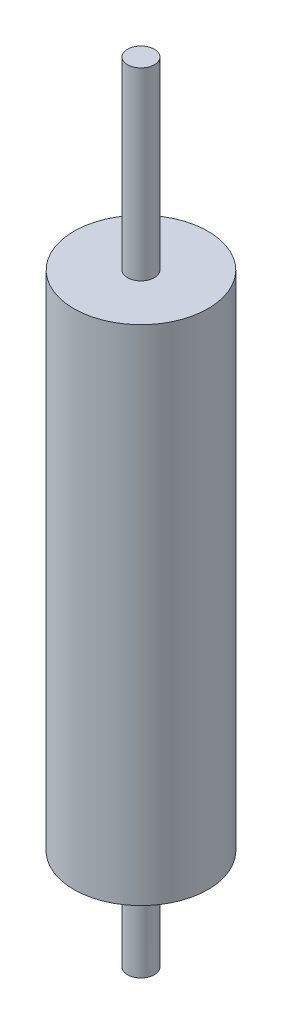
ISO-10303-21;
HEADER;
FILE_DESCRIPTION(('STEP AP214'),'2;1');
FILE_NAME('part.step','',(''),(''),'','','');
FILE_SCHEMA(('AUTOMOTIVE_DESIGN { 1 0 10303 214 1 1 1 1 }'));
ENDSEC;
DATA;
#1=APPLICATION_CONTEXT('core data for automotive mechanical design processes');
#2=APPLICATION_PROTOCOL_DEFINITION('international standard','automotive_design',2000,#1);
#3=PRODUCT_CONTEXT('',#1,'mechanical');
#4=PRODUCT('Part','Part','',(#3));
#5=PRODUCT_RELATED_PRODUCT_CATEGORY('part','',(#4));
#6=PRODUCT_DEFINITION_FORMATION('','',#4);
#7=PRODUCT_DEFINITION_CONTEXT('part definition',#1,'design');
#8=PRODUCT_DEFINITION('design','',#6,#7);
#9=PRODUCT_DEFINITION_SHAPE('','',#8);
#10=(LENGTH_UNIT() NAMED_UNIT(*) SI_UNIT(.MILLI.,.METRE.));
#11=(NAMED_UNIT(*) PLANE_ANGLE_UNIT() SI_UNIT($,.RADIAN.));
#12=(NAMED_UNIT(*) SI_UNIT($,.STERADIAN.) SOLID_ANGLE_UNIT());
#13=UNCERTAINTY_MEASURE_WITH_UNIT(LENGTH_MEASURE(1.E-05),#10,'distance_accuracy_value','');
#14=(GEOMETRIC_REPRESENTATION_CONTEXT(3) GLOBAL_UNCERTAINTY_ASSIGNED_CONTEXT((#13)) GLOBAL_UNIT_ASSIGNED_CONTEXT((#10,
#11,#12)) REPRESENTATION_CONTEXT('',''));
#15=CARTESIAN_POINT('',(0.,0.,0.));
#16=DIRECTION('',(0.,0.,1.));
#17=DIRECTION('',(1.,0.,0.));
#18=AXIS2_PLACEMENT_3D('',#15,#16,#17);
#19=CARTESIAN_POINT('',(0.,150.,0.));
#20=DIRECTION('',(0.,-1.,0.));
#21=DIRECTION('',(0.,0.,-1.));
#22=AXIS2_PLACEMENT_3D('',#19,#20,#21);
#23=CYLINDRICAL_SURFACE('',#22,20.);
#24=CARTESIAN_POINT('',(0.,150.,0.));
#25=DIRECTION('',(0.,1.,0.));
#26=DIRECTION('',(0.,0.,1.));
#27=AXIS2_PLACEMENT_3D('',#24,#25,#26);
#28=CIRCLE('',#27,20.);
#29=CARTESIAN_POINT('',(0.,150.,20.));
#30=VERTEX_POINT('',#29);
#31=EDGE_CURVE('E41',#30,#30,#28,.T.);
#32=ORIENTED_EDGE('',*,*,#31,.F.);
#33=EDGE_LOOP('',(#32));
#34=FACE_BOUND('',#33,.T.);
#35=CARTESIAN_POINT('',(0.,0.,0.));
#36=DIRECTION('',(0.,1.,0.));
#37=DIRECTION('',(0.,0.,1.));
#38=AXIS2_PLACEMENT_3D('',#35,#36,#37);
#39=CIRCLE('',#38,20.);
#40=CARTESIAN_POINT('',(0.,0.,20.));
#41=VERTEX_POINT('',#40);
#42=EDGE_CURVE('E45',#41,#41,#39,.T.);
#43=ORIENTED_EDGE('',*,*,#42,.T.);
#44=EDGE_LOOP('',(#43));
#45=FACE_BOUND('',#44,.T.);
#46=ADVANCED_FACE('F31',(#34,#45),#23,.T.);
#47=CARTESIAN_POINT('',(0.,150.,0.));
#48=DIRECTION('',(0.,1.,0.));
#49=DIRECTION('',(0.,0.,1.));
#50=AXIS2_PLACEMENT_3D('',#47,#48,#49);
#51=PLANE('',#50);
#52=CARTESIAN_POINT('',(0.,150.,0.));
#53=DIRECTION('',(0.,1.,0.));
#54=DIRECTION('',(0.,0.,1.));
#55=AXIS2_PLACEMENT_3D('',#52,#53,#54);
#56=CIRCLE('',#55,4.);
#57=CARTESIAN_POINT('',(0.,150.,4.));
#58=VERTEX_POINT('',#57);
#59=EDGE_CURVE('E10',#58,#58,#56,.T.);
#60=ORIENTED_EDGE('',*,*,#59,.F.);
#61=EDGE_LOOP('',(#60));
#62=FACE_BOUND('',#61,.T.);
#63=ORIENTED_EDGE('',*,*,#31,.T.);
#64=EDGE_LOOP('',(#63));
#65=FACE_BOUND('',#64,.T.);
#66=ADVANCED_FACE('F72',(#62,#65),#51,.T.);
#67=CARTESIAN_POINT('',(0.,0.,0.));
#68=DIRECTION('',(0.,1.,0.));
#69=DIRECTION('',(0.,0.,1.));
#70=AXIS2_PLACEMENT_3D('',#67,#68,#69);
#71=PLANE('',#70);
#72=CARTESIAN_POINT('',(0.,0.,0.));
#73=DIRECTION('',(0.,1.,0.));
#74=DIRECTION('',(0.,0.,1.));
#75=AXIS2_PLACEMENT_3D('',#72,#73,#74);
#76=CIRCLE('',#75,4.);
#77=CARTESIAN_POINT('',(0.,0.,4.));
#78=VERTEX_POINT('',#77);
#79=EDGE_CURVE('E37',#78,#78,#76,.F.);
#80=ORIENTED_EDGE('',*,*,#79,.F.);
#81=EDGE_LOOP('',(#80));
#82=FACE_BOUND('',#81,.T.);
#83=ORIENTED_EDGE('',*,*,#42,.F.);
#84=EDGE_LOOP('',(#83));
#85=FACE_BOUND('',#84,.T.);
#86=ADVANCED_FACE('F77',(#82,#85),#71,.F.);
#87=CARTESIAN_POINT('',(0.,-30.,0.));
#88=DIRECTION('',(0.,1.,0.));
#89=DIRECTION('',(0.,0.,1.));
#90=AXIS2_PLACEMENT_3D('',#87,#88,#89);
#91=CYLINDRICAL_SURFACE('',#90,4.);
#92=CARTESIAN_POINT('',(0.,-30.,0.));
#93=DIRECTION('',(0.,-1.,0.));
#94=DIRECTION('',(0.,0.,-1.));
#95=AXIS2_PLACEMENT_3D('',#92,#93,#94);
#96=CIRCLE('',#95,4.);
#97=CARTESIAN_POINT('',(0.,-30.,-4.));
#98=VERTEX_POINT('',#97);
#99=EDGE_CURVE('E49',#98,#98,#96,.T.);
#100=ORIENTED_EDGE('',*,*,#99,.F.);
#101=EDGE_LOOP('',(#100));
#102=FACE_BOUND('',#101,.T.);
#103=ORIENTED_EDGE('',*,*,#79,.T.);
#104=EDGE_LOOP('',(#103));
#105=FACE_BOUND('',#104,.T.);
#106=ADVANCED_FACE('F68',(#102,#105),#91,.T.);
#107=CARTESIAN_POINT('',(0.,-30.,0.));
#108=DIRECTION('',(0.,-1.,0.));
#109=DIRECTION('',(0.,0.,-1.));
#110=AXIS2_PLACEMENT_3D('',#107,#108,#109);
#111=PLANE('',#110);
#112=ORIENTED_EDGE('',*,*,#99,.T.);
#113=EDGE_LOOP('',(#112));
#114=FACE_BOUND('',#113,.T.);
#115=ADVANCED_FACE('F61',(#114),#111,.T.);
#116=CARTESIAN_POINT('',(0.,180.,0.));
#117=DIRECTION('',(0.,-1.,0.));
#118=DIRECTION('',(0.,0.,-1.));
#119=AXIS2_PLACEMENT_3D('',#116,#117,#118);
#120=CYLINDRICAL_SURFACE('',#119,4.);
#121=ORIENTED_EDGE('',*,*,#59,.T.);
#122=EDGE_LOOP('',(#121));
#123=FACE_BOUND('',#122,.T.);
#124=CARTESIAN_POINT('',(0.,205.,0.));
#125=DIRECTION('',(0.,1.,0.));
#126=DIRECTION('',(0.,0.,1.));
#127=AXIS2_PLACEMENT_3D('',#124,#125,#126);
#128=CIRCLE('',#127,4.);
#129=CARTESIAN_POINT('',(0.,205.,4.));
#130=VERTEX_POINT('',#129);
#131=EDGE_CURVE('E53',#130,#130,#128,.T.);
#132=ORIENTED_EDGE('',*,*,#131,.F.);
#133=EDGE_LOOP('',(#132));
#134=FACE_BOUND('',#133,.T.);
#135=ADVANCED_FACE('F59',(#123,#134),#120,.T.);
#136=CARTESIAN_POINT('',(0.,205.,0.));
#137=DIRECTION('',(0.,1.,0.));
#138=DIRECTION('',(0.,0.,1.));
#139=AXIS2_PLACEMENT_3D('',#136,#137,#138);
#140=PLANE('',#139);
#141=ORIENTED_EDGE('',*,*,#131,.T.);
#142=EDGE_LOOP('',(#141));
#143=FACE_BOUND('',#142,.T.);
#144=ADVANCED_FACE('F57',(#143),#140,.T.);
#145=CLOSED_SHELL('',(#46,#66,#86,#106,#115,#135,#144));
#146=MANIFOLD_SOLID_BREP('B2',#145);
#147=ADVANCED_BREP_SHAPE_REPRESENTATION('',(#18,#146),#14);
#148=SHAPE_DEFINITION_REPRESENTATION(#9,#147);
ENDSEC;
END-ISO-10303-21;
